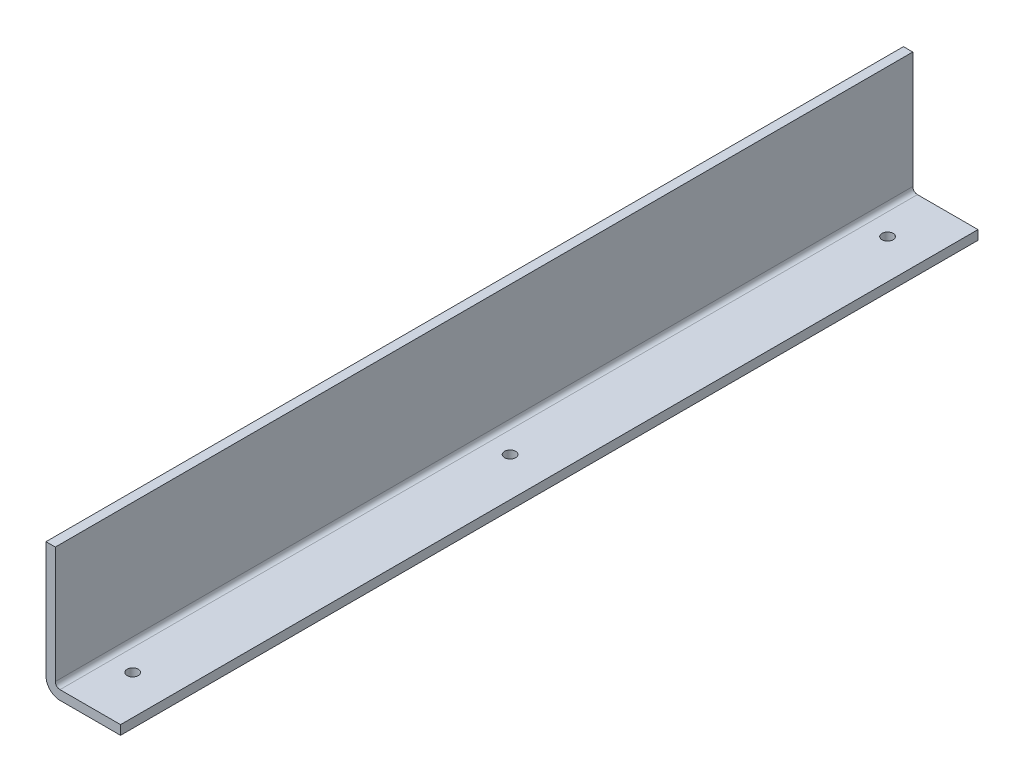
ISO-10303-21;
HEADER;
FILE_DESCRIPTION(('STEP AP214'),'2;1');
FILE_NAME('part.step','',(''),(''),'','','');
FILE_SCHEMA(('AUTOMOTIVE_DESIGN { 1 0 10303 214 1 1 1 1 }'));
ENDSEC;
DATA;
#1=APPLICATION_CONTEXT('core data for automotive mechanical design processes');
#2=APPLICATION_PROTOCOL_DEFINITION('international standard','automotive_design',2000,#1);
#3=PRODUCT_CONTEXT('',#1,'mechanical');
#4=PRODUCT('Part','Part','',(#3));
#5=PRODUCT_RELATED_PRODUCT_CATEGORY('part','',(#4));
#6=PRODUCT_DEFINITION_FORMATION('','',#4);
#7=PRODUCT_DEFINITION_CONTEXT('part definition',#1,'design');
#8=PRODUCT_DEFINITION('design','',#6,#7);
#9=PRODUCT_DEFINITION_SHAPE('','',#8);
#10=(LENGTH_UNIT() NAMED_UNIT(*) SI_UNIT(.MILLI.,.METRE.));
#11=(NAMED_UNIT(*) PLANE_ANGLE_UNIT() SI_UNIT($,.RADIAN.));
#12=(NAMED_UNIT(*) SI_UNIT($,.STERADIAN.) SOLID_ANGLE_UNIT());
#13=UNCERTAINTY_MEASURE_WITH_UNIT(LENGTH_MEASURE(1.E-05),#10,'distance_accuracy_value','');
#14=(GEOMETRIC_REPRESENTATION_CONTEXT(3) GLOBAL_UNCERTAINTY_ASSIGNED_CONTEXT((#13)) GLOBAL_UNIT_ASSIGNED_CONTEXT((#10,
#11,#12)) REPRESENTATION_CONTEXT('',''));
#15=CARTESIAN_POINT('',(0.,0.,0.));
#16=DIRECTION('',(0.,0.,1.));
#17=DIRECTION('',(1.,0.,0.));
#18=AXIS2_PLACEMENT_3D('',#15,#16,#17);
#19=CARTESIAN_POINT('',(15.,0.,460.));
#20=DIRECTION('',(0.,1.,0.));
#21=DIRECTION('',(0.,0.,1.));
#22=AXIS2_PLACEMENT_3D('',#19,#20,#21);
#23=PLANE('',#22);
#24=CARTESIAN_POINT('',(38.,0.,-405.));
#25=DIRECTION('',(0.,1.,0.));
#26=DIRECTION('',(-1.,0.,0.));
#27=AXIS2_PLACEMENT_3D('',#24,#25,#26);
#28=CIRCLE('',#27,6.00000000000001);
#29=CARTESIAN_POINT('',(32.,0.,-405.));
#30=VERTEX_POINT('',#29);
#31=EDGE_CURVE('E190',#30,#30,#28,.T.);
#32=ORIENTED_EDGE('',*,*,#31,.T.);
#33=EDGE_LOOP('',(#32));
#34=FACE_BOUND('',#33,.T.);
#35=DIRECTION('',(1.,0.,0.));
#36=VECTOR('',#35,1.);
#37=CARTESIAN_POINT('',(15.,0.,-460.));
#38=LINE('',#37,#36);
#39=CARTESIAN_POINT('',(15.,0.,-460.));
#40=VERTEX_POINT('',#39);
#41=CARTESIAN_POINT('',(80.,0.,-460.));
#42=VERTEX_POINT('',#41);
#43=EDGE_CURVE('E142',#40,#42,#38,.T.);
#44=ORIENTED_EDGE('',*,*,#43,.T.);
#45=DIRECTION('',(0.,0.,-1.));
#46=VECTOR('',#45,1.);
#47=CARTESIAN_POINT('',(80.,0.,460.));
#48=LINE('',#47,#46);
#49=CARTESIAN_POINT('',(80.,0.,460.));
#50=VERTEX_POINT('',#49);
#51=EDGE_CURVE('E153',#50,#42,#48,.T.);
#52=ORIENTED_EDGE('',*,*,#51,.F.);
#53=DIRECTION('',(1.,0.,0.));
#54=VECTOR('',#53,1.);
#55=CARTESIAN_POINT('',(15.,0.,460.));
#56=LINE('',#55,#54);
#57=CARTESIAN_POINT('',(15.,0.,460.));
#58=VERTEX_POINT('',#57);
#59=EDGE_CURVE('E176',#58,#50,#56,.T.);
#60=ORIENTED_EDGE('',*,*,#59,.F.);
#61=DIRECTION('',(0.,0.,-1.));
#62=VECTOR('',#61,1.);
#63=CARTESIAN_POINT('',(15.,0.,460.));
#64=LINE('',#63,#62);
#65=EDGE_CURVE('E156',#58,#40,#64,.T.);
#66=ORIENTED_EDGE('',*,*,#65,.T.);
#67=EDGE_LOOP('',(#44,#52,#60,#66));
#68=FACE_BOUND('',#67,.T.);
#69=CARTESIAN_POINT('',(38.,0.,0.));
#70=DIRECTION('',(0.,1.,0.));
#71=DIRECTION('',(-1.,0.,0.));
#72=AXIS2_PLACEMENT_3D('',#69,#70,#71);
#73=CIRCLE('',#72,6.00000000000001);
#74=CARTESIAN_POINT('',(32.,0.,0.));
#75=VERTEX_POINT('',#74);
#76=EDGE_CURVE('E184',#75,#75,#73,.T.);
#77=ORIENTED_EDGE('',*,*,#76,.T.);
#78=EDGE_LOOP('',(#77));
#79=FACE_BOUND('',#78,.T.);
#80=CARTESIAN_POINT('',(38.,0.,405.));
#81=DIRECTION('',(0.,1.,0.));
#82=DIRECTION('',(-1.,0.,0.));
#83=AXIS2_PLACEMENT_3D('',#80,#81,#82);
#84=CIRCLE('',#83,6.00000000000001);
#85=CARTESIAN_POINT('',(32.,0.,405.));
#86=VERTEX_POINT('',#85);
#87=EDGE_CURVE('E196',#86,#86,#84,.T.);
#88=ORIENTED_EDGE('',*,*,#87,.T.);
#89=EDGE_LOOP('',(#88));
#90=FACE_BOUND('',#89,.T.);
#91=ADVANCED_FACE('F36',(#34,#68,#79,#90),#23,.F.);
#92=CARTESIAN_POINT('',(15.,10.,460.));
#93=DIRECTION('',(0.,-1.,0.));
#94=DIRECTION('',(1.,0.,0.));
#95=AXIS2_PLACEMENT_3D('',#92,#93,#94);
#96=PLANE('',#95);
#97=CARTESIAN_POINT('',(38.,10.,-405.));
#98=DIRECTION('',(0.,1.,0.));
#99=DIRECTION('',(-1.,0.,0.));
#100=AXIS2_PLACEMENT_3D('',#97,#98,#99);
#101=CIRCLE('',#100,6.);
#102=CARTESIAN_POINT('',(32.,10.,-405.));
#103=VERTEX_POINT('',#102);
#104=EDGE_CURVE('E187',#103,#103,#101,.T.);
#105=ORIENTED_EDGE('',*,*,#104,.F.);
#106=EDGE_LOOP('',(#105));
#107=FACE_BOUND('',#106,.T.);
#108=DIRECTION('',(-1.,0.,0.));
#109=VECTOR('',#108,1.);
#110=CARTESIAN_POINT('',(15.,10.,-460.));
#111=LINE('',#110,#109);
#112=CARTESIAN_POINT('',(80.,10.,-460.));
#113=VERTEX_POINT('',#112);
#114=CARTESIAN_POINT('',(15.,10.,-460.));
#115=VERTEX_POINT('',#114);
#116=EDGE_CURVE('E124',#113,#115,#111,.T.);
#117=ORIENTED_EDGE('',*,*,#116,.T.);
#118=DIRECTION('',(0.,0.,-1.));
#119=VECTOR('',#118,1.);
#120=CARTESIAN_POINT('',(15.,10.,460.));
#121=LINE('',#120,#119);
#122=CARTESIAN_POINT('',(15.,10.,460.));
#123=VERTEX_POINT('',#122);
#124=EDGE_CURVE('E120',#123,#115,#121,.T.);
#125=ORIENTED_EDGE('',*,*,#124,.F.);
#126=DIRECTION('',(-1.,0.,0.));
#127=VECTOR('',#126,1.);
#128=CARTESIAN_POINT('',(15.,10.,460.));
#129=LINE('',#128,#127);
#130=CARTESIAN_POINT('',(80.,10.,460.));
#131=VERTEX_POINT('',#130);
#132=EDGE_CURVE('E109',#131,#123,#129,.T.);
#133=ORIENTED_EDGE('',*,*,#132,.F.);
#134=DIRECTION('',(0.,0.,-1.));
#135=VECTOR('',#134,1.);
#136=CARTESIAN_POINT('',(80.,10.,460.));
#137=LINE('',#136,#135);
#138=EDGE_CURVE('E125',#131,#113,#137,.T.);
#139=ORIENTED_EDGE('',*,*,#138,.T.);
#140=EDGE_LOOP('',(#117,#125,#133,#139));
#141=FACE_BOUND('',#140,.T.);
#142=CARTESIAN_POINT('',(38.,10.,0.));
#143=DIRECTION('',(0.,1.,0.));
#144=DIRECTION('',(-1.,0.,0.));
#145=AXIS2_PLACEMENT_3D('',#142,#143,#144);
#146=CIRCLE('',#145,6.);
#147=CARTESIAN_POINT('',(32.,10.,0.));
#148=VERTEX_POINT('',#147);
#149=EDGE_CURVE('E138',#148,#148,#146,.T.);
#150=ORIENTED_EDGE('',*,*,#149,.F.);
#151=EDGE_LOOP('',(#150));
#152=FACE_BOUND('',#151,.T.);
#153=CARTESIAN_POINT('',(38.,10.,405.));
#154=DIRECTION('',(0.,1.,0.));
#155=DIRECTION('',(-1.,0.,0.));
#156=AXIS2_PLACEMENT_3D('',#153,#154,#155);
#157=CIRCLE('',#156,6.);
#158=CARTESIAN_POINT('',(32.,10.,405.));
#159=VERTEX_POINT('',#158);
#160=EDGE_CURVE('E193',#159,#159,#157,.T.);
#161=ORIENTED_EDGE('',*,*,#160,.F.);
#162=EDGE_LOOP('',(#161));
#163=FACE_BOUND('',#162,.T.);
#164=ADVANCED_FACE('F121',(#107,#141,#152,#163),#96,.F.);
#165=CARTESIAN_POINT('',(0.,140.,460.));
#166=DIRECTION('',(0.,-1.,0.));
#167=DIRECTION('',(0.,0.,-1.));
#168=AXIS2_PLACEMENT_3D('',#165,#166,#167);
#169=PLANE('',#168);
#170=DIRECTION('',(-1.,0.,0.));
#171=VECTOR('',#170,1.);
#172=CARTESIAN_POINT('',(0.,140.,-460.));
#173=LINE('',#172,#171);
#174=CARTESIAN_POINT('',(9.99999999999999,140.,-460.));
#175=VERTEX_POINT('',#174);
#176=CARTESIAN_POINT('',(0.,140.,-460.));
#177=VERTEX_POINT('',#176);
#178=EDGE_CURVE('E134',#175,#177,#173,.T.);
#179=ORIENTED_EDGE('',*,*,#178,.T.);
#180=DIRECTION('',(0.,0.,-1.));
#181=VECTOR('',#180,1.);
#182=CARTESIAN_POINT('',(0.,140.,460.));
#183=LINE('',#182,#181);
#184=CARTESIAN_POINT('',(0.,140.,460.));
#185=VERTEX_POINT('',#184);
#186=EDGE_CURVE('E11',#185,#177,#183,.T.);
#187=ORIENTED_EDGE('',*,*,#186,.F.);
#188=DIRECTION('',(-1.,0.,0.));
#189=VECTOR('',#188,1.);
#190=CARTESIAN_POINT('',(0.,140.,460.));
#191=LINE('',#190,#189);
#192=CARTESIAN_POINT('',(9.99999999999999,140.,460.));
#193=VERTEX_POINT('',#192);
#194=EDGE_CURVE('E149',#193,#185,#191,.T.);
#195=ORIENTED_EDGE('',*,*,#194,.F.);
#196=DIRECTION('',(0.,0.,-1.));
#197=VECTOR('',#196,1.);
#198=CARTESIAN_POINT('',(9.99999999999999,140.,460.));
#199=LINE('',#198,#197);
#200=EDGE_CURVE('E130',#193,#175,#199,.T.);
#201=ORIENTED_EDGE('',*,*,#200,.T.);
#202=EDGE_LOOP('',(#179,#187,#195,#201));
#203=FACE_BOUND('',#202,.T.);
#204=ADVANCED_FACE('F38',(#203),#169,.F.);
#205=CARTESIAN_POINT('',(0.,140.,460.));
#206=DIRECTION('',(1.,0.,0.));
#207=DIRECTION('',(0.,1.,0.));
#208=AXIS2_PLACEMENT_3D('',#205,#206,#207);
#209=PLANE('',#208);
#210=DIRECTION('',(0.,-1.,0.));
#211=VECTOR('',#210,1.);
#212=CARTESIAN_POINT('',(0.,140.,-460.));
#213=LINE('',#212,#211);
#214=CARTESIAN_POINT('',(0.,15.,-460.));
#215=VERTEX_POINT('',#214);
#216=EDGE_CURVE('E137',#177,#215,#213,.T.);
#217=ORIENTED_EDGE('',*,*,#216,.T.);
#218=DIRECTION('',(0.,0.,-1.));
#219=VECTOR('',#218,1.);
#220=CARTESIAN_POINT('',(0.,15.,460.));
#221=LINE('',#220,#219);
#222=CARTESIAN_POINT('',(0.,15.,460.));
#223=VERTEX_POINT('',#222);
#224=EDGE_CURVE('E45',#223,#215,#221,.T.);
#225=ORIENTED_EDGE('',*,*,#224,.F.);
#226=DIRECTION('',(0.,-1.,0.));
#227=VECTOR('',#226,1.);
#228=CARTESIAN_POINT('',(0.,140.,460.));
#229=LINE('',#228,#227);
#230=EDGE_CURVE('E96',#185,#223,#229,.T.);
#231=ORIENTED_EDGE('',*,*,#230,.F.);
#232=ORIENTED_EDGE('',*,*,#186,.T.);
#233=EDGE_LOOP('',(#217,#225,#231,#232));
#234=FACE_BOUND('',#233,.T.);
#235=ADVANCED_FACE('F223',(#234),#209,.F.);
#236=CARTESIAN_POINT('',(15.,15.,460.));
#237=DIRECTION('',(0.,0.,-1.));
#238=DIRECTION('',(-1.,0.,0.));
#239=AXIS2_PLACEMENT_3D('',#236,#237,#238);
#240=CYLINDRICAL_SURFACE('',#239,15.);
#241=CARTESIAN_POINT('',(15.,15.,-460.));
#242=DIRECTION('',(0.,0.,1.));
#243=DIRECTION('',(1.,0.,0.));
#244=AXIS2_PLACEMENT_3D('',#241,#242,#243);
#245=CIRCLE('',#244,15.);
#246=EDGE_CURVE('E140',#215,#40,#245,.T.);
#247=ORIENTED_EDGE('',*,*,#246,.T.);
#248=ORIENTED_EDGE('',*,*,#65,.F.);
#249=CARTESIAN_POINT('',(15.,15.,460.));
#250=DIRECTION('',(0.,0.,1.));
#251=DIRECTION('',(1.,0.,0.));
#252=AXIS2_PLACEMENT_3D('',#249,#250,#251);
#253=CIRCLE('',#252,15.);
#254=EDGE_CURVE('E164',#223,#58,#253,.T.);
#255=ORIENTED_EDGE('',*,*,#254,.F.);
#256=ORIENTED_EDGE('',*,*,#224,.T.);
#257=EDGE_LOOP('',(#247,#248,#255,#256));
#258=FACE_BOUND('',#257,.T.);
#259=ADVANCED_FACE('F162',(#258),#240,.T.);
#260=CARTESIAN_POINT('',(80.,10.,460.));
#261=DIRECTION('',(-1.,0.,0.));
#262=DIRECTION('',(0.,0.,1.));
#263=AXIS2_PLACEMENT_3D('',#260,#261,#262);
#264=PLANE('',#263);
#265=DIRECTION('',(0.,1.,0.));
#266=VECTOR('',#265,1.);
#267=CARTESIAN_POINT('',(80.,10.,-460.));
#268=LINE('',#267,#266);
#269=EDGE_CURVE('E144',#42,#113,#268,.T.);
#270=ORIENTED_EDGE('',*,*,#269,.T.);
#271=ORIENTED_EDGE('',*,*,#138,.F.);
#272=DIRECTION('',(0.,1.,0.));
#273=VECTOR('',#272,1.);
#274=CARTESIAN_POINT('',(80.,10.,460.));
#275=LINE('',#274,#273);
#276=EDGE_CURVE('E115',#50,#131,#275,.T.);
#277=ORIENTED_EDGE('',*,*,#276,.F.);
#278=ORIENTED_EDGE('',*,*,#51,.T.);
#279=EDGE_LOOP('',(#270,#271,#277,#278));
#280=FACE_BOUND('',#279,.T.);
#281=ADVANCED_FACE('F175',(#280),#264,.F.);
#282=CARTESIAN_POINT('',(15.,15.,460.));
#283=DIRECTION('',(0.,0.,-1.));
#284=DIRECTION('',(-1.,0.,0.));
#285=AXIS2_PLACEMENT_3D('',#282,#283,#284);
#286=CYLINDRICAL_SURFACE('',#285,5.);
#287=CARTESIAN_POINT('',(15.,15.,-460.));
#288=DIRECTION('',(0.,0.,-1.));
#289=DIRECTION('',(1.,0.,0.));
#290=AXIS2_PLACEMENT_3D('',#287,#288,#289);
#291=CIRCLE('',#290,5.);
#292=CARTESIAN_POINT('',(10.,15.,-460.));
#293=VERTEX_POINT('',#292);
#294=EDGE_CURVE('E82',#115,#293,#291,.T.);
#295=ORIENTED_EDGE('',*,*,#294,.T.);
#296=DIRECTION('',(0.,0.,-1.));
#297=VECTOR('',#296,1.);
#298=CARTESIAN_POINT('',(10.,15.,460.));
#299=LINE('',#298,#297);
#300=CARTESIAN_POINT('',(10.,15.,460.));
#301=VERTEX_POINT('',#300);
#302=EDGE_CURVE('E126',#301,#293,#299,.T.);
#303=ORIENTED_EDGE('',*,*,#302,.F.);
#304=CARTESIAN_POINT('',(15.,15.,460.));
#305=DIRECTION('',(0.,0.,-1.));
#306=DIRECTION('',(1.,0.,0.));
#307=AXIS2_PLACEMENT_3D('',#304,#305,#306);
#308=CIRCLE('',#307,5.);
#309=EDGE_CURVE('E113',#123,#301,#308,.T.);
#310=ORIENTED_EDGE('',*,*,#309,.F.);
#311=ORIENTED_EDGE('',*,*,#124,.T.);
#312=EDGE_LOOP('',(#295,#303,#310,#311));
#313=FACE_BOUND('',#312,.T.);
#314=ADVANCED_FACE('F128',(#313),#286,.F.);
#315=CARTESIAN_POINT('',(9.99999999999999,140.,460.));
#316=DIRECTION('',(-1.,0.,0.));
#317=DIRECTION('',(0.,-1.,0.));
#318=AXIS2_PLACEMENT_3D('',#315,#316,#317);
#319=PLANE('',#318);
#320=DIRECTION('',(0.,1.,0.));
#321=VECTOR('',#320,1.);
#322=CARTESIAN_POINT('',(9.99999999999999,140.,-460.));
#323=LINE('',#322,#321);
#324=EDGE_CURVE('E88',#293,#175,#323,.T.);
#325=ORIENTED_EDGE('',*,*,#324,.T.);
#326=ORIENTED_EDGE('',*,*,#200,.F.);
#327=DIRECTION('',(0.,1.,0.));
#328=VECTOR('',#327,1.);
#329=CARTESIAN_POINT('',(9.99999999999999,140.,460.));
#330=LINE('',#329,#328);
#331=EDGE_CURVE('E53',#301,#193,#330,.T.);
#332=ORIENTED_EDGE('',*,*,#331,.F.);
#333=ORIENTED_EDGE('',*,*,#302,.T.);
#334=EDGE_LOOP('',(#325,#326,#332,#333));
#335=FACE_BOUND('',#334,.T.);
#336=ADVANCED_FACE('F231',(#335),#319,.F.);
#337=CARTESIAN_POINT('',(15.,15.,460.));
#338=DIRECTION('',(0.,0.,1.));
#339=DIRECTION('',(1.,0.,0.));
#340=AXIS2_PLACEMENT_3D('',#337,#338,#339);
#341=PLANE('',#340);
#342=ORIENTED_EDGE('',*,*,#194,.T.);
#343=ORIENTED_EDGE('',*,*,#230,.T.);
#344=ORIENTED_EDGE('',*,*,#254,.T.);
#345=ORIENTED_EDGE('',*,*,#59,.T.);
#346=ORIENTED_EDGE('',*,*,#276,.T.);
#347=ORIENTED_EDGE('',*,*,#132,.T.);
#348=ORIENTED_EDGE('',*,*,#309,.T.);
#349=ORIENTED_EDGE('',*,*,#331,.T.);
#350=EDGE_LOOP('',(#342,#343,#344,#345,#346,#347,#348,#349));
#351=FACE_BOUND('',#350,.T.);
#352=ADVANCED_FACE('F111',(#351),#341,.T.);
#353=CARTESIAN_POINT('',(15.,15.,-460.));
#354=DIRECTION('',(0.,0.,1.));
#355=DIRECTION('',(1.,0.,0.));
#356=AXIS2_PLACEMENT_3D('',#353,#354,#355);
#357=PLANE('',#356);
#358=ORIENTED_EDGE('',*,*,#178,.F.);
#359=ORIENTED_EDGE('',*,*,#324,.F.);
#360=ORIENTED_EDGE('',*,*,#294,.F.);
#361=ORIENTED_EDGE('',*,*,#116,.F.);
#362=ORIENTED_EDGE('',*,*,#269,.F.);
#363=ORIENTED_EDGE('',*,*,#43,.F.);
#364=ORIENTED_EDGE('',*,*,#246,.F.);
#365=ORIENTED_EDGE('',*,*,#216,.F.);
#366=EDGE_LOOP('',(#358,#359,#360,#361,#362,#363,#364,#365));
#367=FACE_BOUND('',#366,.T.);
#368=ADVANCED_FACE('F168',(#367),#357,.F.);
#369=CARTESIAN_POINT('',(38.,38.7282869805851,0.));
#370=DIRECTION('',(0.,1.,0.));
#371=DIRECTION('',(-1.,0.,0.));
#372=AXIS2_PLACEMENT_3D('',#369,#370,#371);
#373=CYLINDRICAL_SURFACE('',#372,6.);
#374=ORIENTED_EDGE('',*,*,#149,.T.);
#375=EDGE_LOOP('',(#374));
#376=FACE_BOUND('',#375,.T.);
#377=ORIENTED_EDGE('',*,*,#76,.F.);
#378=EDGE_LOOP('',(#377));
#379=FACE_BOUND('',#378,.T.);
#380=ADVANCED_FACE('F209',(#376,#379),#373,.F.);
#381=CARTESIAN_POINT('',(38.,38.7282869805851,-405.));
#382=DIRECTION('',(0.,1.,0.));
#383=DIRECTION('',(-1.,0.,0.));
#384=AXIS2_PLACEMENT_3D('',#381,#382,#383);
#385=CYLINDRICAL_SURFACE('',#384,6.);
#386=ORIENTED_EDGE('',*,*,#104,.T.);
#387=EDGE_LOOP('',(#386));
#388=FACE_BOUND('',#387,.T.);
#389=ORIENTED_EDGE('',*,*,#31,.F.);
#390=EDGE_LOOP('',(#389));
#391=FACE_BOUND('',#390,.T.);
#392=ADVANCED_FACE('F203',(#388,#391),#385,.F.);
#393=CARTESIAN_POINT('',(38.,38.7282869805851,405.));
#394=DIRECTION('',(0.,1.,0.));
#395=DIRECTION('',(-1.,0.,0.));
#396=AXIS2_PLACEMENT_3D('',#393,#394,#395);
#397=CYLINDRICAL_SURFACE('',#396,6.);
#398=ORIENTED_EDGE('',*,*,#160,.T.);
#399=EDGE_LOOP('',(#398));
#400=FACE_BOUND('',#399,.T.);
#401=ORIENTED_EDGE('',*,*,#87,.F.);
#402=EDGE_LOOP('',(#401));
#403=FACE_BOUND('',#402,.T.);
#404=ADVANCED_FACE('F201',(#400,#403),#397,.F.);
#405=CLOSED_SHELL('',(#91,#164,#204,#235,#259,#281,#314,#336,#352,#368,#380,#392,#404));
#406=MANIFOLD_SOLID_BREP('B2',#405);
#407=ADVANCED_BREP_SHAPE_REPRESENTATION('',(#18,#406),#14);
#408=SHAPE_DEFINITION_REPRESENTATION(#9,#407);
ENDSEC;
END-ISO-10303-21;
